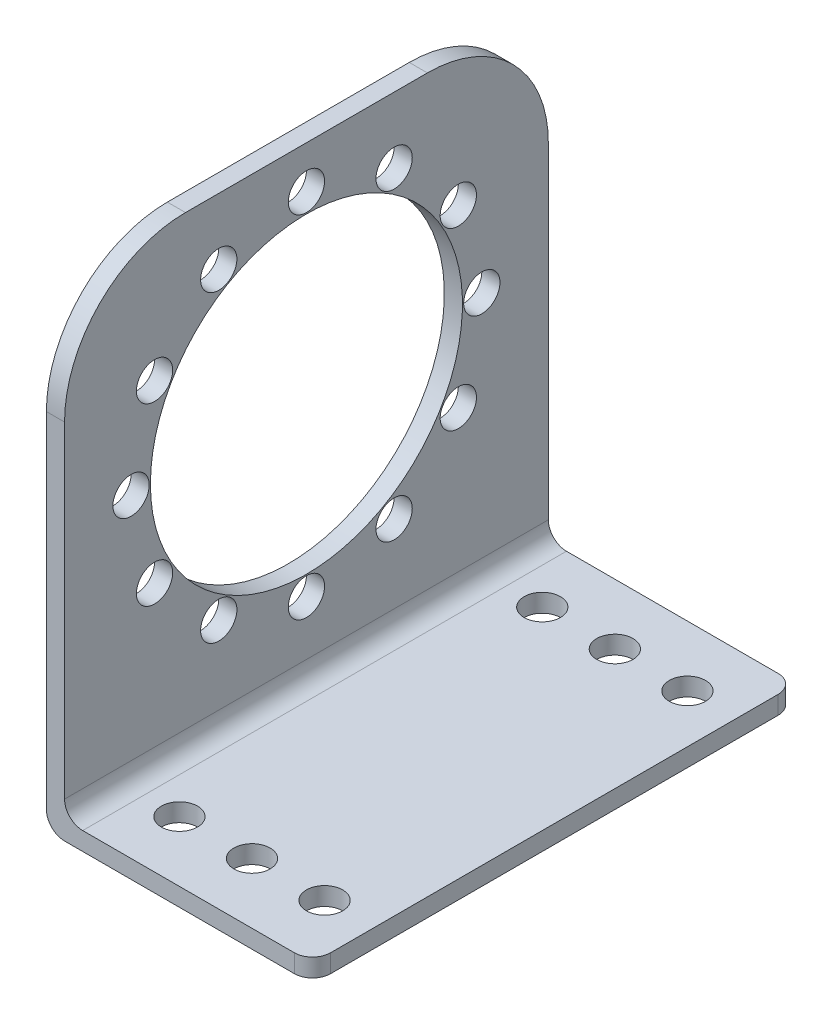
ISO-10303-21;
HEADER;
FILE_DESCRIPTION(('STEP AP214'),'2;1');
FILE_NAME('part.step','',(''),(''),'','','');
FILE_SCHEMA(('AUTOMOTIVE_DESIGN { 1 0 10303 214 1 1 1 1 }'));
ENDSEC;
DATA;
#1=APPLICATION_CONTEXT('core data for automotive mechanical design processes');
#2=APPLICATION_PROTOCOL_DEFINITION('international standard','automotive_design',2000,#1);
#3=PRODUCT_CONTEXT('',#1,'mechanical');
#4=PRODUCT('Part','Part','',(#3));
#5=PRODUCT_RELATED_PRODUCT_CATEGORY('part','',(#4));
#6=PRODUCT_DEFINITION_FORMATION('','',#4);
#7=PRODUCT_DEFINITION_CONTEXT('part definition',#1,'design');
#8=PRODUCT_DEFINITION('design','',#6,#7);
#9=PRODUCT_DEFINITION_SHAPE('','',#8);
#10=(LENGTH_UNIT() NAMED_UNIT(*) SI_UNIT(.MILLI.,.METRE.));
#11=(NAMED_UNIT(*) PLANE_ANGLE_UNIT() SI_UNIT($,.RADIAN.));
#12=(NAMED_UNIT(*) SI_UNIT($,.STERADIAN.) SOLID_ANGLE_UNIT());
#13=UNCERTAINTY_MEASURE_WITH_UNIT(LENGTH_MEASURE(1.E-05),#10,'distance_accuracy_value','');
#14=(GEOMETRIC_REPRESENTATION_CONTEXT(3) GLOBAL_UNCERTAINTY_ASSIGNED_CONTEXT((#13)) GLOBAL_UNIT_ASSIGNED_CONTEXT((#10,
#11,#12)) REPRESENTATION_CONTEXT('',''));
#15=CARTESIAN_POINT('',(0.,0.,0.));
#16=DIRECTION('',(0.,0.,1.));
#17=DIRECTION('',(1.,0.,0.));
#18=AXIS2_PLACEMENT_3D('',#15,#16,#17);
#19=CARTESIAN_POINT('',(1.5,40.,0.));
#20=DIRECTION('',(-1.,0.,0.));
#21=DIRECTION('',(0.,0.,1.));
#22=AXIS2_PLACEMENT_3D('',#19,#20,#21);
#23=PLANE('',#22);
#24=CARTESIAN_POINT('',(1.5,22.,20.));
#25=DIRECTION('',(-1.,0.,0.));
#26=DIRECTION('',(0.,0.,1.));
#27=AXIS2_PLACEMENT_3D('',#24,#25,#26);
#28=CIRCLE('',#27,12.9);
#29=CARTESIAN_POINT('',(1.5,22.,32.9));
#30=VERTEX_POINT('',#29);
#31=EDGE_CURVE('E478',#30,#30,#28,.T.);
#32=ORIENTED_EDGE('',*,*,#31,.T.);
#33=EDGE_LOOP('',(#32));
#34=FACE_BOUND('',#33,.T.);
#35=CARTESIAN_POINT('',(1.5,34.5573683548741,27.2499999999998));
#36=DIRECTION('',(1.,0.,0.));
#37=DIRECTION('',(0.,0.,-1.));
#38=AXIS2_PLACEMENT_3D('',#35,#36,#37);
#39=CIRCLE('',#38,1.5);
#40=CARTESIAN_POINT('',(1.5,34.5573683548741,25.7499999999998));
#41=VERTEX_POINT('',#40);
#42=EDGE_CURVE('E492',#41,#41,#39,.T.);
#43=ORIENTED_EDGE('',*,*,#42,.F.);
#44=EDGE_LOOP('',(#43));
#45=FACE_BOUND('',#44,.T.);
#46=CARTESIAN_POINT('',(1.5,36.5,20.));
#47=DIRECTION('',(1.,0.,0.));
#48=DIRECTION('',(0.,0.,-1.));
#49=AXIS2_PLACEMENT_3D('',#46,#47,#48);
#50=CIRCLE('',#49,1.5);
#51=CARTESIAN_POINT('',(1.5,36.5,18.5));
#52=VERTEX_POINT('',#51);
#53=EDGE_CURVE('E495',#52,#52,#50,.T.);
#54=ORIENTED_EDGE('',*,*,#53,.F.);
#55=EDGE_LOOP('',(#54));
#56=FACE_BOUND('',#55,.T.);
#57=CARTESIAN_POINT('',(1.5,34.5573683548747,12.7499999999999));
#58=DIRECTION('',(1.,0.,0.));
#59=DIRECTION('',(0.,0.,-1.));
#60=AXIS2_PLACEMENT_3D('',#57,#58,#59);
#61=CIRCLE('',#60,1.5);
#62=CARTESIAN_POINT('',(1.5,34.5573683548747,11.2499999999999));
#63=VERTEX_POINT('',#62);
#64=EDGE_CURVE('E498',#63,#63,#61,.T.);
#65=ORIENTED_EDGE('',*,*,#64,.F.);
#66=EDGE_LOOP('',(#65));
#67=FACE_BOUND('',#66,.T.);
#68=CARTESIAN_POINT('',(1.5,29.2500000000005,7.44263164512531));
#69=DIRECTION('',(1.,0.,0.));
#70=DIRECTION('',(0.,0.,-1.));
#71=AXIS2_PLACEMENT_3D('',#68,#69,#70);
#72=CIRCLE('',#71,1.5);
#73=CARTESIAN_POINT('',(1.5,29.2500000000005,5.94263164512531));
#74=VERTEX_POINT('',#73);
#75=EDGE_CURVE('E501',#74,#74,#72,.T.);
#76=ORIENTED_EDGE('',*,*,#75,.F.);
#77=EDGE_LOOP('',(#76));
#78=FACE_BOUND('',#77,.T.);
#79=CARTESIAN_POINT('',(1.5,22.0000000000006,5.49999999999939));
#80=DIRECTION('',(1.,0.,0.));
#81=DIRECTION('',(0.,0.,-1.));
#82=AXIS2_PLACEMENT_3D('',#79,#80,#81);
#83=CIRCLE('',#82,1.5);
#84=CARTESIAN_POINT('',(1.5,22.0000000000006,3.99999999999939));
#85=VERTEX_POINT('',#84);
#86=EDGE_CURVE('E504',#85,#85,#83,.T.);
#87=ORIENTED_EDGE('',*,*,#86,.F.);
#88=EDGE_LOOP('',(#87));
#89=FACE_BOUND('',#88,.T.);
#90=CARTESIAN_POINT('',(1.5,14.7500000000005,7.44263164512475));
#91=DIRECTION('',(1.,0.,0.));
#92=DIRECTION('',(0.,0.,-1.));
#93=AXIS2_PLACEMENT_3D('',#90,#91,#92);
#94=CIRCLE('',#93,1.5);
#95=CARTESIAN_POINT('',(1.5,14.7500000000005,5.94263164512475));
#96=VERTEX_POINT('',#95);
#97=EDGE_CURVE('E507',#96,#96,#94,.T.);
#98=ORIENTED_EDGE('',*,*,#97,.F.);
#99=EDGE_LOOP('',(#98));
#100=FACE_BOUND('',#99,.T.);
#101=CARTESIAN_POINT('',(1.5,9.44263164512591,12.7499999999989));
#102=DIRECTION('',(1.,0.,0.));
#103=DIRECTION('',(0.,0.,-1.));
#104=AXIS2_PLACEMENT_3D('',#101,#102,#103);
#105=CIRCLE('',#104,1.5);
#106=CARTESIAN_POINT('',(1.5,9.44263164512591,11.2499999999989));
#107=VERTEX_POINT('',#106);
#108=EDGE_CURVE('E510',#107,#107,#105,.T.);
#109=ORIENTED_EDGE('',*,*,#108,.F.);
#110=EDGE_LOOP('',(#109));
#111=FACE_BOUND('',#110,.T.);
#112=CARTESIAN_POINT('',(1.5,7.5,19.9999999999989));
#113=DIRECTION('',(1.,0.,0.));
#114=DIRECTION('',(0.,0.,-1.));
#115=AXIS2_PLACEMENT_3D('',#112,#113,#114);
#116=CIRCLE('',#115,1.5);
#117=CARTESIAN_POINT('',(1.5,7.5,18.4999999999989));
#118=VERTEX_POINT('',#117);
#119=EDGE_CURVE('E489',#118,#118,#116,.T.);
#120=ORIENTED_EDGE('',*,*,#119,.F.);
#121=EDGE_LOOP('',(#120));
#122=FACE_BOUND('',#121,.T.);
#123=CARTESIAN_POINT('',(1.5,9.4426316451254,27.249999999999));
#124=DIRECTION('',(1.,0.,0.));
#125=DIRECTION('',(0.,0.,-1.));
#126=AXIS2_PLACEMENT_3D('',#123,#124,#125);
#127=CIRCLE('',#126,1.5);
#128=CARTESIAN_POINT('',(1.5,9.4426316451254,25.749999999999));
#129=VERTEX_POINT('',#128);
#130=EDGE_CURVE('E486',#129,#129,#127,.T.);
#131=ORIENTED_EDGE('',*,*,#130,.F.);
#132=EDGE_LOOP('',(#131));
#133=FACE_BOUND('',#132,.T.);
#134=CARTESIAN_POINT('',(1.5,14.7499999999996,32.5573683548735));
#135=DIRECTION('',(1.,0.,0.));
#136=DIRECTION('',(0.,0.,-1.));
#137=AXIS2_PLACEMENT_3D('',#134,#135,#136);
#138=CIRCLE('',#137,1.5);
#139=CARTESIAN_POINT('',(1.5,14.7499999999996,31.0573683548735));
#140=VERTEX_POINT('',#139);
#141=EDGE_CURVE('E482',#140,#140,#138,.T.);
#142=ORIENTED_EDGE('',*,*,#141,.F.);
#143=EDGE_LOOP('',(#142));
#144=FACE_BOUND('',#143,.T.);
#145=CARTESIAN_POINT('',(1.5,21.9999999999995,34.4999999999994));
#146=DIRECTION('',(1.,0.,0.));
#147=DIRECTION('',(0.,0.,-1.));
#148=AXIS2_PLACEMENT_3D('',#145,#146,#147);
#149=CIRCLE('',#148,1.5);
#150=CARTESIAN_POINT('',(1.5,21.9999999999995,32.9999999999994));
#151=VERTEX_POINT('',#150);
#152=EDGE_CURVE('E479',#151,#151,#149,.T.);
#153=ORIENTED_EDGE('',*,*,#152,.F.);
#154=EDGE_LOOP('',(#153));
#155=FACE_BOUND('',#154,.T.);
#156=CARTESIAN_POINT('',(1.5,29.2499999999996,32.557368354874));
#157=DIRECTION('',(1.,0.,0.));
#158=DIRECTION('',(0.,0.,-1.));
#159=AXIS2_PLACEMENT_3D('',#156,#157,#158);
#160=CIRCLE('',#159,1.5);
#161=CARTESIAN_POINT('',(1.5,29.2499999999996,31.057368354874));
#162=VERTEX_POINT('',#161);
#163=EDGE_CURVE('E207',#162,#162,#160,.T.);
#164=ORIENTED_EDGE('',*,*,#163,.F.);
#165=EDGE_LOOP('',(#164));
#166=FACE_BOUND('',#165,.T.);
#167=DIRECTION('',(0.,-1.,0.));
#168=VECTOR('',#167,1.);
#169=CARTESIAN_POINT('',(1.5,40.,0.));
#170=LINE('',#169,#168);
#171=CARTESIAN_POINT('',(1.5,30.,0.));
#172=VERTEX_POINT('',#171);
#173=CARTESIAN_POINT('',(1.5,3.,0.));
#174=VERTEX_POINT('',#173);
#175=EDGE_CURVE('E300',#172,#174,#170,.T.);
#176=ORIENTED_EDGE('',*,*,#175,.F.);
#177=CARTESIAN_POINT('',(1.5,30.,10.));
#178=DIRECTION('',(-1.,0.,0.));
#179=DIRECTION('',(0.,0.,1.));
#180=AXIS2_PLACEMENT_3D('',#177,#178,#179);
#181=CIRCLE('',#180,10.);
#182=CARTESIAN_POINT('',(1.5,40.,10.));
#183=VERTEX_POINT('',#182);
#184=EDGE_CURVE('E186',#172,#183,#181,.F.);
#185=ORIENTED_EDGE('',*,*,#184,.T.);
#186=DIRECTION('',(0.,0.,-1.));
#187=VECTOR('',#186,1.);
#188=CARTESIAN_POINT('',(1.5,40.,0.));
#189=LINE('',#188,#187);
#190=CARTESIAN_POINT('',(1.5,40.,30.));
#191=VERTEX_POINT('',#190);
#192=EDGE_CURVE('E293',#191,#183,#189,.T.);
#193=ORIENTED_EDGE('',*,*,#192,.F.);
#194=CARTESIAN_POINT('',(1.5,30.,30.));
#195=DIRECTION('',(-1.,0.,0.));
#196=DIRECTION('',(0.,0.,1.));
#197=AXIS2_PLACEMENT_3D('',#194,#195,#196);
#198=CIRCLE('',#197,10.);
#199=CARTESIAN_POINT('',(1.5,30.,40.));
#200=VERTEX_POINT('',#199);
#201=EDGE_CURVE('E174',#191,#200,#198,.F.);
#202=ORIENTED_EDGE('',*,*,#201,.T.);
#203=DIRECTION('',(0.,-1.,0.));
#204=VECTOR('',#203,1.);
#205=CARTESIAN_POINT('',(1.5,40.,40.));
#206=LINE('',#205,#204);
#207=CARTESIAN_POINT('',(1.5,3.,40.));
#208=VERTEX_POINT('',#207);
#209=EDGE_CURVE('E138',#200,#208,#206,.T.);
#210=ORIENTED_EDGE('',*,*,#209,.T.);
#211=DIRECTION('',(0.,0.,1.));
#212=VECTOR('',#211,1.);
#213=CARTESIAN_POINT('',(1.5,3.,0.));
#214=LINE('',#213,#212);
#215=EDGE_CURVE('E162',#208,#174,#214,.F.);
#216=ORIENTED_EDGE('',*,*,#215,.T.);
#217=EDGE_LOOP('',(#176,#185,#193,#202,#210,#216));
#218=FACE_BOUND('',#217,.T.);
#219=ADVANCED_FACE('F36',(#34,#45,#56,#67,#78,#89,#100,#111,#122,#133,#144,#155,#166,#218),#23,.F.);
#220=CARTESIAN_POINT('',(0.,40.,40.));
#221=DIRECTION('',(1.,0.,0.));
#222=DIRECTION('',(0.,0.,-1.));
#223=AXIS2_PLACEMENT_3D('',#220,#221,#222);
#224=PLANE('',#223);
#225=CARTESIAN_POINT('',(0.,22.,20.));
#226=DIRECTION('',(-1.,0.,0.));
#227=DIRECTION('',(0.,0.,1.));
#228=AXIS2_PLACEMENT_3D('',#225,#226,#227);
#229=CIRCLE('',#228,12.9);
#230=CARTESIAN_POINT('',(0.,22.,32.9));
#231=VERTEX_POINT('',#230);
#232=EDGE_CURVE('E476',#231,#231,#229,.T.);
#233=ORIENTED_EDGE('',*,*,#232,.F.);
#234=EDGE_LOOP('',(#233));
#235=FACE_BOUND('',#234,.T.);
#236=CARTESIAN_POINT('',(0.,34.5573683548741,27.2499999999998));
#237=DIRECTION('',(1.,0.,0.));
#238=DIRECTION('',(0.,0.,-1.));
#239=AXIS2_PLACEMENT_3D('',#236,#237,#238);
#240=CIRCLE('',#239,1.5);
#241=CARTESIAN_POINT('',(0.,34.5573683548741,25.7499999999998));
#242=VERTEX_POINT('',#241);
#243=EDGE_CURVE('E40',#242,#242,#240,.T.);
#244=ORIENTED_EDGE('',*,*,#243,.T.);
#245=EDGE_LOOP('',(#244));
#246=FACE_BOUND('',#245,.T.);
#247=CARTESIAN_POINT('',(0.,36.5,20.));
#248=DIRECTION('',(1.,0.,0.));
#249=DIRECTION('',(0.,0.,-1.));
#250=AXIS2_PLACEMENT_3D('',#247,#248,#249);
#251=CIRCLE('',#250,1.5);
#252=CARTESIAN_POINT('',(0.,36.5,18.5));
#253=VERTEX_POINT('',#252);
#254=EDGE_CURVE('E233',#253,#253,#251,.T.);
#255=ORIENTED_EDGE('',*,*,#254,.T.);
#256=EDGE_LOOP('',(#255));
#257=FACE_BOUND('',#256,.T.);
#258=CARTESIAN_POINT('',(0.,34.5573683548747,12.7499999999999));
#259=DIRECTION('',(1.,0.,0.));
#260=DIRECTION('',(0.,0.,-1.));
#261=AXIS2_PLACEMENT_3D('',#258,#259,#260);
#262=CIRCLE('',#261,1.5);
#263=CARTESIAN_POINT('',(0.,34.5573683548747,11.2499999999999));
#264=VERTEX_POINT('',#263);
#265=EDGE_CURVE('E231',#264,#264,#262,.T.);
#266=ORIENTED_EDGE('',*,*,#265,.T.);
#267=EDGE_LOOP('',(#266));
#268=FACE_BOUND('',#267,.T.);
#269=CARTESIAN_POINT('',(0.,29.2500000000005,7.44263164512531));
#270=DIRECTION('',(1.,0.,0.));
#271=DIRECTION('',(0.,0.,-1.));
#272=AXIS2_PLACEMENT_3D('',#269,#270,#271);
#273=CIRCLE('',#272,1.5);
#274=CARTESIAN_POINT('',(0.,29.2500000000005,5.94263164512531));
#275=VERTEX_POINT('',#274);
#276=EDGE_CURVE('E228',#275,#275,#273,.T.);
#277=ORIENTED_EDGE('',*,*,#276,.T.);
#278=EDGE_LOOP('',(#277));
#279=FACE_BOUND('',#278,.T.);
#280=CARTESIAN_POINT('',(0.,22.0000000000006,5.49999999999939));
#281=DIRECTION('',(1.,0.,0.));
#282=DIRECTION('',(0.,0.,-1.));
#283=AXIS2_PLACEMENT_3D('',#280,#281,#282);
#284=CIRCLE('',#283,1.5);
#285=CARTESIAN_POINT('',(0.,22.0000000000006,3.99999999999939));
#286=VERTEX_POINT('',#285);
#287=EDGE_CURVE('E225',#286,#286,#284,.T.);
#288=ORIENTED_EDGE('',*,*,#287,.T.);
#289=EDGE_LOOP('',(#288));
#290=FACE_BOUND('',#289,.T.);
#291=CARTESIAN_POINT('',(0.,14.7500000000005,7.44263164512475));
#292=DIRECTION('',(1.,0.,0.));
#293=DIRECTION('',(0.,0.,-1.));
#294=AXIS2_PLACEMENT_3D('',#291,#292,#293);
#295=CIRCLE('',#294,1.5);
#296=CARTESIAN_POINT('',(0.,14.7500000000005,5.94263164512475));
#297=VERTEX_POINT('',#296);
#298=EDGE_CURVE('E222',#297,#297,#295,.T.);
#299=ORIENTED_EDGE('',*,*,#298,.T.);
#300=EDGE_LOOP('',(#299));
#301=FACE_BOUND('',#300,.T.);
#302=CARTESIAN_POINT('',(0.,9.44263164512591,12.7499999999989));
#303=DIRECTION('',(1.,0.,0.));
#304=DIRECTION('',(0.,0.,-1.));
#305=AXIS2_PLACEMENT_3D('',#302,#303,#304);
#306=CIRCLE('',#305,1.5);
#307=CARTESIAN_POINT('',(0.,9.44263164512591,11.2499999999989));
#308=VERTEX_POINT('',#307);
#309=EDGE_CURVE('E219',#308,#308,#306,.T.);
#310=ORIENTED_EDGE('',*,*,#309,.T.);
#311=EDGE_LOOP('',(#310));
#312=FACE_BOUND('',#311,.T.);
#313=CARTESIAN_POINT('',(0.,7.5,19.9999999999989));
#314=DIRECTION('',(1.,0.,0.));
#315=DIRECTION('',(0.,0.,-1.));
#316=AXIS2_PLACEMENT_3D('',#313,#314,#315);
#317=CIRCLE('',#316,1.5);
#318=CARTESIAN_POINT('',(0.,7.5,18.4999999999989));
#319=VERTEX_POINT('',#318);
#320=EDGE_CURVE('E216',#319,#319,#317,.T.);
#321=ORIENTED_EDGE('',*,*,#320,.T.);
#322=EDGE_LOOP('',(#321));
#323=FACE_BOUND('',#322,.T.);
#324=CARTESIAN_POINT('',(0.,9.4426316451254,27.249999999999));
#325=DIRECTION('',(1.,0.,0.));
#326=DIRECTION('',(0.,0.,-1.));
#327=AXIS2_PLACEMENT_3D('',#324,#325,#326);
#328=CIRCLE('',#327,1.5);
#329=CARTESIAN_POINT('',(0.,9.4426316451254,25.749999999999));
#330=VERTEX_POINT('',#329);
#331=EDGE_CURVE('E213',#330,#330,#328,.T.);
#332=ORIENTED_EDGE('',*,*,#331,.T.);
#333=EDGE_LOOP('',(#332));
#334=FACE_BOUND('',#333,.T.);
#335=CARTESIAN_POINT('',(0.,14.7499999999996,32.5573683548735));
#336=DIRECTION('',(1.,0.,0.));
#337=DIRECTION('',(0.,0.,-1.));
#338=AXIS2_PLACEMENT_3D('',#335,#336,#337);
#339=CIRCLE('',#338,1.5);
#340=CARTESIAN_POINT('',(0.,14.7499999999996,31.0573683548735));
#341=VERTEX_POINT('',#340);
#342=EDGE_CURVE('E210',#341,#341,#339,.T.);
#343=ORIENTED_EDGE('',*,*,#342,.T.);
#344=EDGE_LOOP('',(#343));
#345=FACE_BOUND('',#344,.T.);
#346=CARTESIAN_POINT('',(0.,21.9999999999995,34.4999999999994));
#347=DIRECTION('',(1.,0.,0.));
#348=DIRECTION('',(0.,0.,-1.));
#349=AXIS2_PLACEMENT_3D('',#346,#347,#348);
#350=CIRCLE('',#349,1.5);
#351=CARTESIAN_POINT('',(0.,21.9999999999995,32.9999999999994));
#352=VERTEX_POINT('',#351);
#353=EDGE_CURVE('E206',#352,#352,#350,.T.);
#354=ORIENTED_EDGE('',*,*,#353,.T.);
#355=EDGE_LOOP('',(#354));
#356=FACE_BOUND('',#355,.T.);
#357=CARTESIAN_POINT('',(0.,29.2499999999996,32.557368354874));
#358=DIRECTION('',(1.,0.,0.));
#359=DIRECTION('',(0.,0.,-1.));
#360=AXIS2_PLACEMENT_3D('',#357,#358,#359);
#361=CIRCLE('',#360,1.5);
#362=CARTESIAN_POINT('',(0.,29.2499999999996,31.057368354874));
#363=VERTEX_POINT('',#362);
#364=EDGE_CURVE('E203',#363,#363,#361,.T.);
#365=ORIENTED_EDGE('',*,*,#364,.T.);
#366=EDGE_LOOP('',(#365));
#367=FACE_BOUND('',#366,.T.);
#368=DIRECTION('',(0.,0.,1.));
#369=VECTOR('',#368,1.);
#370=CARTESIAN_POINT('',(0.,40.,40.));
#371=LINE('',#370,#369);
#372=CARTESIAN_POINT('',(0.,40.,10.));
#373=VERTEX_POINT('',#372);
#374=CARTESIAN_POINT('',(0.,40.,30.));
#375=VERTEX_POINT('',#374);
#376=EDGE_CURVE('E291',#373,#375,#371,.T.);
#377=ORIENTED_EDGE('',*,*,#376,.F.);
#378=CARTESIAN_POINT('',(0.,30.,10.));
#379=DIRECTION('',(1.,0.,0.));
#380=DIRECTION('',(0.,0.,-1.));
#381=AXIS2_PLACEMENT_3D('',#378,#379,#380);
#382=CIRCLE('',#381,10.);
#383=CARTESIAN_POINT('',(0.,30.,0.));
#384=VERTEX_POINT('',#383);
#385=EDGE_CURVE('E182',#373,#384,#382,.F.);
#386=ORIENTED_EDGE('',*,*,#385,.T.);
#387=DIRECTION('',(0.,-1.,0.));
#388=VECTOR('',#387,1.);
#389=CARTESIAN_POINT('',(0.,40.,0.));
#390=LINE('',#389,#388);
#391=CARTESIAN_POINT('',(0.,1.5,0.));
#392=VERTEX_POINT('',#391);
#393=EDGE_CURVE('E151',#384,#392,#390,.T.);
#394=ORIENTED_EDGE('',*,*,#393,.T.);
#395=DIRECTION('',(0.,0.,1.));
#396=VECTOR('',#395,1.);
#397=CARTESIAN_POINT('',(0.,1.5,40.));
#398=LINE('',#397,#396);
#399=CARTESIAN_POINT('',(0.,1.5,40.));
#400=VERTEX_POINT('',#399);
#401=EDGE_CURVE('E137',#392,#400,#398,.T.);
#402=ORIENTED_EDGE('',*,*,#401,.T.);
#403=DIRECTION('',(0.,-1.,0.));
#404=VECTOR('',#403,1.);
#405=CARTESIAN_POINT('',(0.,40.,40.));
#406=LINE('',#405,#404);
#407=CARTESIAN_POINT('',(0.,30.,40.));
#408=VERTEX_POINT('',#407);
#409=EDGE_CURVE('E124',#408,#400,#406,.T.);
#410=ORIENTED_EDGE('',*,*,#409,.F.);
#411=CARTESIAN_POINT('',(0.,30.,30.));
#412=DIRECTION('',(1.,0.,0.));
#413=DIRECTION('',(0.,0.,-1.));
#414=AXIS2_PLACEMENT_3D('',#411,#412,#413);
#415=CIRCLE('',#414,10.);
#416=EDGE_CURVE('E177',#408,#375,#415,.F.);
#417=ORIENTED_EDGE('',*,*,#416,.T.);
#418=EDGE_LOOP('',(#377,#386,#394,#402,#410,#417));
#419=FACE_BOUND('',#418,.T.);
#420=ADVANCED_FACE('F149',(#235,#246,#257,#268,#279,#290,#301,#312,#323,#334,#345,#356,#367,
#419),#224,.F.);
#421=CARTESIAN_POINT('',(1.5,40.,40.));
#422=DIRECTION('',(0.,0.,-1.));
#423=DIRECTION('',(-1.,0.,0.));
#424=AXIS2_PLACEMENT_3D('',#421,#422,#423);
#425=PLANE('',#424);
#426=DIRECTION('',(1.,0.,0.));
#427=VECTOR('',#426,1.);
#428=CARTESIAN_POINT('',(1.5,0.,40.));
#429=LINE('',#428,#427);
#430=CARTESIAN_POINT('',(1.5,0.,40.));
#431=VERTEX_POINT('',#430);
#432=CARTESIAN_POINT('',(20.5,0.,40.));
#433=VERTEX_POINT('',#432);
#434=EDGE_CURVE('E290',#431,#433,#429,.T.);
#435=ORIENTED_EDGE('',*,*,#434,.T.);
#436=DIRECTION('',(0.,-1.,0.));
#437=VECTOR('',#436,1.);
#438=CARTESIAN_POINT('',(20.5,40.,40.));
#439=LINE('',#438,#437);
#440=CARTESIAN_POINT('',(20.5,1.5,40.));
#441=VERTEX_POINT('',#440);
#442=EDGE_CURVE('E193',#433,#441,#439,.F.);
#443=ORIENTED_EDGE('',*,*,#442,.T.);
#444=DIRECTION('',(-1.,0.,0.));
#445=VECTOR('',#444,1.);
#446=CARTESIAN_POINT('',(22.,1.5,40.));
#447=LINE('',#446,#445);
#448=CARTESIAN_POINT('',(3.,1.5,40.));
#449=VERTEX_POINT('',#448);
#450=EDGE_CURVE('E286',#441,#449,#447,.T.);
#451=ORIENTED_EDGE('',*,*,#450,.T.);
#452=CARTESIAN_POINT('',(3.,3.,40.));
#453=DIRECTION('',(0.,0.,-1.));
#454=DIRECTION('',(-1.,0.,0.));
#455=AXIS2_PLACEMENT_3D('',#452,#453,#454);
#456=CIRCLE('',#455,1.5);
#457=EDGE_CURVE('E165',#449,#208,#456,.T.);
#458=ORIENTED_EDGE('',*,*,#457,.T.);
#459=ORIENTED_EDGE('',*,*,#209,.F.);
#460=DIRECTION('',(1.,0.,0.));
#461=VECTOR('',#460,1.);
#462=CARTESIAN_POINT('',(1.5,30.,40.));
#463=LINE('',#462,#461);
#464=EDGE_CURVE('E132',#200,#408,#463,.F.);
#465=ORIENTED_EDGE('',*,*,#464,.T.);
#466=ORIENTED_EDGE('',*,*,#409,.T.);
#467=CARTESIAN_POINT('',(1.5,1.5,40.));
#468=DIRECTION('',(0.,0.,-1.));
#469=DIRECTION('',(-1.,0.,0.));
#470=AXIS2_PLACEMENT_3D('',#467,#468,#469);
#471=CIRCLE('',#470,1.5);
#472=EDGE_CURVE('E128',#400,#431,#471,.F.);
#473=ORIENTED_EDGE('',*,*,#472,.T.);
#474=EDGE_LOOP('',(#435,#443,#451,#458,#459,#465,#466,#473));
#475=FACE_BOUND('',#474,.T.);
#476=ADVANCED_FACE('F127',(#475),#425,.F.);
#477=CARTESIAN_POINT('',(0.,40.,0.));
#478=DIRECTION('',(0.,0.,1.));
#479=DIRECTION('',(1.,0.,0.));
#480=AXIS2_PLACEMENT_3D('',#477,#478,#479);
#481=PLANE('',#480);
#482=DIRECTION('',(-1.,0.,0.));
#483=VECTOR('',#482,1.);
#484=CARTESIAN_POINT('',(22.,1.5,0.));
#485=LINE('',#484,#483);
#486=CARTESIAN_POINT('',(20.5,1.5,0.));
#487=VERTEX_POINT('',#486);
#488=CARTESIAN_POINT('',(3.,1.5,0.));
#489=VERTEX_POINT('',#488);
#490=EDGE_CURVE('E288',#487,#489,#485,.T.);
#491=ORIENTED_EDGE('',*,*,#490,.F.);
#492=DIRECTION('',(0.,1.,0.));
#493=VECTOR('',#492,1.);
#494=CARTESIAN_POINT('',(20.5,40.,0.));
#495=LINE('',#494,#493);
#496=CARTESIAN_POINT('',(20.5,0.,0.));
#497=VERTEX_POINT('',#496);
#498=EDGE_CURVE('E45',#487,#497,#495,.F.);
#499=ORIENTED_EDGE('',*,*,#498,.T.);
#500=DIRECTION('',(-1.,0.,0.));
#501=VECTOR('',#500,1.);
#502=CARTESIAN_POINT('',(0.,0.,0.));
#503=LINE('',#502,#501);
#504=CARTESIAN_POINT('',(1.5,0.,0.));
#505=VERTEX_POINT('',#504);
#506=EDGE_CURVE('E294',#497,#505,#503,.T.);
#507=ORIENTED_EDGE('',*,*,#506,.T.);
#508=CARTESIAN_POINT('',(1.5,1.5,0.));
#509=DIRECTION('',(0.,0.,1.));
#510=DIRECTION('',(1.,0.,0.));
#511=AXIS2_PLACEMENT_3D('',#508,#509,#510);
#512=CIRCLE('',#511,1.5);
#513=EDGE_CURVE('E157',#505,#392,#512,.F.);
#514=ORIENTED_EDGE('',*,*,#513,.T.);
#515=ORIENTED_EDGE('',*,*,#393,.F.);
#516=DIRECTION('',(-1.,0.,0.));
#517=VECTOR('',#516,1.);
#518=CARTESIAN_POINT('',(0.,30.,0.));
#519=LINE('',#518,#517);
#520=EDGE_CURVE('E184',#384,#172,#519,.F.);
#521=ORIENTED_EDGE('',*,*,#520,.T.);
#522=ORIENTED_EDGE('',*,*,#175,.T.);
#523=CARTESIAN_POINT('',(3.,3.,0.));
#524=DIRECTION('',(0.,0.,1.));
#525=DIRECTION('',(1.,0.,0.));
#526=AXIS2_PLACEMENT_3D('',#523,#524,#525);
#527=CIRCLE('',#526,1.5);
#528=EDGE_CURVE('E168',#174,#489,#527,.T.);
#529=ORIENTED_EDGE('',*,*,#528,.T.);
#530=EDGE_LOOP('',(#491,#499,#507,#514,#515,#521,#522,#529));
#531=FACE_BOUND('',#530,.T.);
#532=ADVANCED_FACE('F311',(#531),#481,.F.);
#533=CARTESIAN_POINT('',(0.,40.,0.));
#534=DIRECTION('',(0.,-1.,0.));
#535=DIRECTION('',(0.,0.,-1.));
#536=AXIS2_PLACEMENT_3D('',#533,#534,#535);
#537=PLANE('',#536);
#538=ORIENTED_EDGE('',*,*,#192,.T.);
#539=DIRECTION('',(-1.,0.,0.));
#540=VECTOR('',#539,1.);
#541=CARTESIAN_POINT('',(0.,40.,10.));
#542=LINE('',#541,#540);
#543=EDGE_CURVE('E179',#183,#373,#542,.T.);
#544=ORIENTED_EDGE('',*,*,#543,.T.);
#545=ORIENTED_EDGE('',*,*,#376,.T.);
#546=DIRECTION('',(1.,0.,0.));
#547=VECTOR('',#546,1.);
#548=CARTESIAN_POINT('',(0.,40.,30.));
#549=LINE('',#548,#547);
#550=EDGE_CURVE('E171',#375,#191,#549,.T.);
#551=ORIENTED_EDGE('',*,*,#550,.T.);
#552=EDGE_LOOP('',(#538,#544,#545,#551));
#553=FACE_BOUND('',#552,.T.);
#554=ADVANCED_FACE('F318',(#553),#537,.F.);
#555=CARTESIAN_POINT('',(0.,0.,0.));
#556=DIRECTION('',(0.,-1.,0.));
#557=DIRECTION('',(0.,0.,-1.));
#558=AXIS2_PLACEMENT_3D('',#555,#556,#557);
#559=PLANE('',#558);
#560=CARTESIAN_POINT('',(18.,0.,5.));
#561=DIRECTION('',(0.,-1.,0.));
#562=DIRECTION('',(0.,0.,-1.));
#563=AXIS2_PLACEMENT_3D('',#560,#561,#562);
#564=CIRCLE('',#563,1.5);
#565=CARTESIAN_POINT('',(18.,0.,3.5));
#566=VERTEX_POINT('',#565);
#567=EDGE_CURVE('E278',#566,#566,#564,.T.);
#568=ORIENTED_EDGE('',*,*,#567,.F.);
#569=EDGE_LOOP('',(#568));
#570=FACE_BOUND('',#569,.T.);
#571=CARTESIAN_POINT('',(6.,0.,5.00000000000001));
#572=DIRECTION('',(0.,-1.,0.));
#573=DIRECTION('',(0.,0.,-1.));
#574=AXIS2_PLACEMENT_3D('',#571,#572,#573);
#575=CIRCLE('',#574,1.5);
#576=CARTESIAN_POINT('',(6.,0.,3.50000000000001));
#577=VERTEX_POINT('',#576);
#578=EDGE_CURVE('E275',#577,#577,#575,.T.);
#579=ORIENTED_EDGE('',*,*,#578,.F.);
#580=EDGE_LOOP('',(#579));
#581=FACE_BOUND('',#580,.T.);
#582=CARTESIAN_POINT('',(18.,0.,35.));
#583=DIRECTION('',(0.,-1.,0.));
#584=DIRECTION('',(0.,0.,-1.));
#585=AXIS2_PLACEMENT_3D('',#582,#583,#584);
#586=CIRCLE('',#585,1.5);
#587=CARTESIAN_POINT('',(18.,0.,33.5));
#588=VERTEX_POINT('',#587);
#589=EDGE_CURVE('E272',#588,#588,#586,.T.);
#590=ORIENTED_EDGE('',*,*,#589,.F.);
#591=EDGE_LOOP('',(#590));
#592=FACE_BOUND('',#591,.T.);
#593=CARTESIAN_POINT('',(12.,0.,35.));
#594=DIRECTION('',(0.,-1.,0.));
#595=DIRECTION('',(0.,0.,-1.));
#596=AXIS2_PLACEMENT_3D('',#593,#594,#595);
#597=CIRCLE('',#596,1.5);
#598=CARTESIAN_POINT('',(12.,0.,33.5));
#599=VERTEX_POINT('',#598);
#600=EDGE_CURVE('E269',#599,#599,#597,.T.);
#601=ORIENTED_EDGE('',*,*,#600,.F.);
#602=EDGE_LOOP('',(#601));
#603=FACE_BOUND('',#602,.T.);
#604=CARTESIAN_POINT('',(6.,0.,35.));
#605=DIRECTION('',(0.,-1.,0.));
#606=DIRECTION('',(0.,0.,-1.));
#607=AXIS2_PLACEMENT_3D('',#604,#605,#606);
#608=CIRCLE('',#607,1.5);
#609=CARTESIAN_POINT('',(6.,0.,33.5));
#610=VERTEX_POINT('',#609);
#611=EDGE_CURVE('E266',#610,#610,#608,.T.);
#612=ORIENTED_EDGE('',*,*,#611,.F.);
#613=EDGE_LOOP('',(#612));
#614=FACE_BOUND('',#613,.T.);
#615=CARTESIAN_POINT('',(12.,0.,5.));
#616=DIRECTION('',(0.,-1.,0.));
#617=DIRECTION('',(0.,0.,-1.));
#618=AXIS2_PLACEMENT_3D('',#615,#616,#617);
#619=CIRCLE('',#618,1.5);
#620=CARTESIAN_POINT('',(12.,0.,3.50000000000001));
#621=VERTEX_POINT('',#620);
#622=EDGE_CURVE('E263',#621,#621,#619,.T.);
#623=ORIENTED_EDGE('',*,*,#622,.F.);
#624=EDGE_LOOP('',(#623));
#625=FACE_BOUND('',#624,.T.);
#626=ORIENTED_EDGE('',*,*,#506,.F.);
#627=CARTESIAN_POINT('',(20.5,0.,1.5));
#628=DIRECTION('',(0.,-1.,0.));
#629=DIRECTION('',(0.,0.,-1.));
#630=AXIS2_PLACEMENT_3D('',#627,#628,#629);
#631=CIRCLE('',#630,1.5);
#632=CARTESIAN_POINT('',(22.,0.,1.5));
#633=VERTEX_POINT('',#632);
#634=EDGE_CURVE('E11',#497,#633,#631,.T.);
#635=ORIENTED_EDGE('',*,*,#634,.T.);
#636=DIRECTION('',(0.,0.,-1.));
#637=VECTOR('',#636,1.);
#638=CARTESIAN_POINT('',(22.,0.,0.));
#639=LINE('',#638,#637);
#640=CARTESIAN_POINT('',(22.,0.,38.5));
#641=VERTEX_POINT('',#640);
#642=EDGE_CURVE('E281',#641,#633,#639,.T.);
#643=ORIENTED_EDGE('',*,*,#642,.F.);
#644=CARTESIAN_POINT('',(20.5,0.,38.5));
#645=DIRECTION('',(0.,-1.,0.));
#646=DIRECTION('',(0.,0.,-1.));
#647=AXIS2_PLACEMENT_3D('',#644,#645,#646);
#648=CIRCLE('',#647,1.5);
#649=EDGE_CURVE('E191',#641,#433,#648,.T.);
#650=ORIENTED_EDGE('',*,*,#649,.T.);
#651=ORIENTED_EDGE('',*,*,#434,.F.);
#652=DIRECTION('',(0.,0.,1.));
#653=VECTOR('',#652,1.);
#654=CARTESIAN_POINT('',(1.5,0.,0.));
#655=LINE('',#654,#653);
#656=EDGE_CURVE('E146',#431,#505,#655,.F.);
#657=ORIENTED_EDGE('',*,*,#656,.T.);
#658=EDGE_LOOP('',(#626,#635,#643,#650,#651,#657));
#659=FACE_BOUND('',#658,.T.);
#660=ADVANCED_FACE('F383',(#570,#581,#592,#603,#614,#625,#659),#559,.T.);
#661=CARTESIAN_POINT('',(22.,1.5,40.));
#662=DIRECTION('',(0.,-1.,0.));
#663=DIRECTION('',(0.,0.,-1.));
#664=AXIS2_PLACEMENT_3D('',#661,#662,#663);
#665=PLANE('',#664);
#666=CARTESIAN_POINT('',(18.,1.5,5.));
#667=DIRECTION('',(0.,1.,0.));
#668=DIRECTION('',(0.,0.,1.));
#669=AXIS2_PLACEMENT_3D('',#666,#667,#668);
#670=CIRCLE('',#669,1.5);
#671=CARTESIAN_POINT('',(18.,1.5,6.50000000000001));
#672=VERTEX_POINT('',#671);
#673=EDGE_CURVE('E252',#672,#672,#670,.T.);
#674=ORIENTED_EDGE('',*,*,#673,.F.);
#675=EDGE_LOOP('',(#674));
#676=FACE_BOUND('',#675,.T.);
#677=CARTESIAN_POINT('',(6.,1.5,5.00000000000001));
#678=DIRECTION('',(0.,1.,0.));
#679=DIRECTION('',(0.,0.,1.));
#680=AXIS2_PLACEMENT_3D('',#677,#678,#679);
#681=CIRCLE('',#680,1.5);
#682=CARTESIAN_POINT('',(6.,1.5,6.50000000000001));
#683=VERTEX_POINT('',#682);
#684=EDGE_CURVE('E256',#683,#683,#681,.T.);
#685=ORIENTED_EDGE('',*,*,#684,.F.);
#686=EDGE_LOOP('',(#685));
#687=FACE_BOUND('',#686,.T.);
#688=CARTESIAN_POINT('',(18.,1.5,35.));
#689=DIRECTION('',(0.,1.,0.));
#690=DIRECTION('',(0.,0.,1.));
#691=AXIS2_PLACEMENT_3D('',#688,#689,#690);
#692=CIRCLE('',#691,1.5);
#693=CARTESIAN_POINT('',(18.,1.5,36.5));
#694=VERTEX_POINT('',#693);
#695=EDGE_CURVE('E247',#694,#694,#692,.T.);
#696=ORIENTED_EDGE('',*,*,#695,.F.);
#697=EDGE_LOOP('',(#696));
#698=FACE_BOUND('',#697,.T.);
#699=CARTESIAN_POINT('',(12.,1.5,35.));
#700=DIRECTION('',(0.,1.,0.));
#701=DIRECTION('',(0.,0.,1.));
#702=AXIS2_PLACEMENT_3D('',#699,#700,#701);
#703=CIRCLE('',#702,1.5);
#704=CARTESIAN_POINT('',(12.,1.5,36.5));
#705=VERTEX_POINT('',#704);
#706=EDGE_CURVE('E242',#705,#705,#703,.T.);
#707=ORIENTED_EDGE('',*,*,#706,.F.);
#708=EDGE_LOOP('',(#707));
#709=FACE_BOUND('',#708,.T.);
#710=CARTESIAN_POINT('',(6.,1.5,35.));
#711=DIRECTION('',(0.,1.,0.));
#712=DIRECTION('',(0.,0.,1.));
#713=AXIS2_PLACEMENT_3D('',#710,#711,#712);
#714=CIRCLE('',#713,1.5);
#715=CARTESIAN_POINT('',(6.,1.5,36.5));
#716=VERTEX_POINT('',#715);
#717=EDGE_CURVE('E238',#716,#716,#714,.T.);
#718=ORIENTED_EDGE('',*,*,#717,.F.);
#719=EDGE_LOOP('',(#718));
#720=FACE_BOUND('',#719,.T.);
#721=CARTESIAN_POINT('',(12.,1.5,5.));
#722=DIRECTION('',(0.,1.,0.));
#723=DIRECTION('',(0.,0.,1.));
#724=AXIS2_PLACEMENT_3D('',#721,#722,#723);
#725=CIRCLE('',#724,1.5);
#726=CARTESIAN_POINT('',(12.,1.5,6.5));
#727=VERTEX_POINT('',#726);
#728=EDGE_CURVE('E255',#727,#727,#725,.T.);
#729=ORIENTED_EDGE('',*,*,#728,.F.);
#730=EDGE_LOOP('',(#729));
#731=FACE_BOUND('',#730,.T.);
#732=DIRECTION('',(0.,0.,1.));
#733=VECTOR('',#732,1.);
#734=CARTESIAN_POINT('',(22.,1.5,40.));
#735=LINE('',#734,#733);
#736=CARTESIAN_POINT('',(22.,1.5,1.5));
#737=VERTEX_POINT('',#736);
#738=CARTESIAN_POINT('',(22.,1.5,38.5));
#739=VERTEX_POINT('',#738);
#740=EDGE_CURVE('E284',#737,#739,#735,.T.);
#741=ORIENTED_EDGE('',*,*,#740,.F.);
#742=CARTESIAN_POINT('',(20.5,1.5,1.5));
#743=DIRECTION('',(0.,-1.,0.));
#744=DIRECTION('',(0.,0.,-1.));
#745=AXIS2_PLACEMENT_3D('',#742,#743,#744);
#746=CIRCLE('',#745,1.5);
#747=EDGE_CURVE('E60',#737,#487,#746,.F.);
#748=ORIENTED_EDGE('',*,*,#747,.T.);
#749=ORIENTED_EDGE('',*,*,#490,.T.);
#750=DIRECTION('',(0.,0.,1.));
#751=VECTOR('',#750,1.);
#752=CARTESIAN_POINT('',(3.,1.5,40.));
#753=LINE('',#752,#751);
#754=EDGE_CURVE('E159',#489,#449,#753,.T.);
#755=ORIENTED_EDGE('',*,*,#754,.T.);
#756=ORIENTED_EDGE('',*,*,#450,.F.);
#757=CARTESIAN_POINT('',(20.5,1.5,38.5));
#758=DIRECTION('',(0.,-1.,0.));
#759=DIRECTION('',(0.,0.,-1.));
#760=AXIS2_PLACEMENT_3D('',#757,#758,#759);
#761=CIRCLE('',#760,1.5);
#762=EDGE_CURVE('E195',#441,#739,#761,.F.);
#763=ORIENTED_EDGE('',*,*,#762,.T.);
#764=EDGE_LOOP('',(#741,#748,#749,#755,#756,#763));
#765=FACE_BOUND('',#764,.T.);
#766=ADVANCED_FACE('F379',(#676,#687,#698,#709,#720,#731,#765),#665,.F.);
#767=CARTESIAN_POINT('',(22.,0.,0.));
#768=DIRECTION('',(-1.,0.,0.));
#769=DIRECTION('',(0.,0.,1.));
#770=AXIS2_PLACEMENT_3D('',#767,#768,#769);
#771=PLANE('',#770);
#772=ORIENTED_EDGE('',*,*,#642,.T.);
#773=DIRECTION('',(0.,1.,0.));
#774=VECTOR('',#773,1.);
#775=CARTESIAN_POINT('',(22.,0.,1.5));
#776=LINE('',#775,#774);
#777=EDGE_CURVE('E198',#633,#737,#776,.T.);
#778=ORIENTED_EDGE('',*,*,#777,.T.);
#779=ORIENTED_EDGE('',*,*,#740,.T.);
#780=DIRECTION('',(0.,-1.,0.));
#781=VECTOR('',#780,1.);
#782=CARTESIAN_POINT('',(22.,0.,38.5));
#783=LINE('',#782,#781);
#784=EDGE_CURVE('E188',#739,#641,#783,.T.);
#785=ORIENTED_EDGE('',*,*,#784,.T.);
#786=EDGE_LOOP('',(#772,#778,#779,#785));
#787=FACE_BOUND('',#786,.T.);
#788=ADVANCED_FACE('F375',(#787),#771,.F.);
#789=CARTESIAN_POINT('',(12.,-19.,5.));
#790=DIRECTION('',(0.,1.,0.));
#791=DIRECTION('',(0.,0.,1.));
#792=AXIS2_PLACEMENT_3D('',#789,#790,#791);
#793=CYLINDRICAL_SURFACE('',#792,1.5);
#794=ORIENTED_EDGE('',*,*,#622,.T.);
#795=EDGE_LOOP('',(#794));
#796=FACE_BOUND('',#795,.T.);
#797=ORIENTED_EDGE('',*,*,#728,.T.);
#798=EDGE_LOOP('',(#797));
#799=FACE_BOUND('',#798,.T.);
#800=ADVANCED_FACE('F372',(#796,#799),#793,.F.);
#801=CARTESIAN_POINT('',(6.,-19.,35.));
#802=DIRECTION('',(0.,1.,0.));
#803=DIRECTION('',(0.,0.,1.));
#804=AXIS2_PLACEMENT_3D('',#801,#802,#803);
#805=CYLINDRICAL_SURFACE('',#804,1.5);
#806=ORIENTED_EDGE('',*,*,#611,.T.);
#807=EDGE_LOOP('',(#806));
#808=FACE_BOUND('',#807,.T.);
#809=ORIENTED_EDGE('',*,*,#717,.T.);
#810=EDGE_LOOP('',(#809));
#811=FACE_BOUND('',#810,.T.);
#812=ADVANCED_FACE('F362',(#808,#811),#805,.F.);
#813=CARTESIAN_POINT('',(12.,-19.,35.));
#814=DIRECTION('',(0.,1.,0.));
#815=DIRECTION('',(0.,0.,1.));
#816=AXIS2_PLACEMENT_3D('',#813,#814,#815);
#817=CYLINDRICAL_SURFACE('',#816,1.5);
#818=ORIENTED_EDGE('',*,*,#600,.T.);
#819=EDGE_LOOP('',(#818));
#820=FACE_BOUND('',#819,.T.);
#821=ORIENTED_EDGE('',*,*,#706,.T.);
#822=EDGE_LOOP('',(#821));
#823=FACE_BOUND('',#822,.T.);
#824=ADVANCED_FACE('F367',(#820,#823),#817,.F.);
#825=CARTESIAN_POINT('',(18.,-19.,35.));
#826=DIRECTION('',(0.,1.,0.));
#827=DIRECTION('',(0.,0.,1.));
#828=AXIS2_PLACEMENT_3D('',#825,#826,#827);
#829=CYLINDRICAL_SURFACE('',#828,1.5);
#830=ORIENTED_EDGE('',*,*,#589,.T.);
#831=EDGE_LOOP('',(#830));
#832=FACE_BOUND('',#831,.T.);
#833=ORIENTED_EDGE('',*,*,#695,.T.);
#834=EDGE_LOOP('',(#833));
#835=FACE_BOUND('',#834,.T.);
#836=ADVANCED_FACE('F357',(#832,#835),#829,.F.);
#837=CARTESIAN_POINT('',(6.,-19.,5.00000000000001));
#838=DIRECTION('',(0.,1.,0.));
#839=DIRECTION('',(0.,0.,1.));
#840=AXIS2_PLACEMENT_3D('',#837,#838,#839);
#841=CYLINDRICAL_SURFACE('',#840,1.5);
#842=ORIENTED_EDGE('',*,*,#578,.T.);
#843=EDGE_LOOP('',(#842));
#844=FACE_BOUND('',#843,.T.);
#845=ORIENTED_EDGE('',*,*,#684,.T.);
#846=EDGE_LOOP('',(#845));
#847=FACE_BOUND('',#846,.T.);
#848=ADVANCED_FACE('F351',(#844,#847),#841,.F.);
#849=CARTESIAN_POINT('',(18.,-19.,5.));
#850=DIRECTION('',(0.,1.,0.));
#851=DIRECTION('',(0.,0.,1.));
#852=AXIS2_PLACEMENT_3D('',#849,#850,#851);
#853=CYLINDRICAL_SURFACE('',#852,1.5);
#854=ORIENTED_EDGE('',*,*,#567,.T.);
#855=EDGE_LOOP('',(#854));
#856=FACE_BOUND('',#855,.T.);
#857=ORIENTED_EDGE('',*,*,#673,.T.);
#858=EDGE_LOOP('',(#857));
#859=FACE_BOUND('',#858,.T.);
#860=ADVANCED_FACE('F347',(#856,#859),#853,.F.);
#861=CARTESIAN_POINT('',(1.5,1.5,40.));
#862=DIRECTION('',(0.,0.,-1.));
#863=DIRECTION('',(-1.,0.,0.));
#864=AXIS2_PLACEMENT_3D('',#861,#862,#863);
#865=CYLINDRICAL_SURFACE('',#864,1.5);
#866=ORIENTED_EDGE('',*,*,#513,.F.);
#867=ORIENTED_EDGE('',*,*,#656,.F.);
#868=ORIENTED_EDGE('',*,*,#472,.F.);
#869=ORIENTED_EDGE('',*,*,#401,.F.);
#870=EDGE_LOOP('',(#866,#867,#868,#869));
#871=FACE_BOUND('',#870,.T.);
#872=ADVANCED_FACE('F144',(#871),#865,.T.);
#873=CARTESIAN_POINT('',(3.,3.,40.));
#874=DIRECTION('',(0.,0.,-1.));
#875=DIRECTION('',(-1.,0.,0.));
#876=AXIS2_PLACEMENT_3D('',#873,#874,#875);
#877=CYLINDRICAL_SURFACE('',#876,1.5);
#878=ORIENTED_EDGE('',*,*,#528,.F.);
#879=ORIENTED_EDGE('',*,*,#215,.F.);
#880=ORIENTED_EDGE('',*,*,#457,.F.);
#881=ORIENTED_EDGE('',*,*,#754,.F.);
#882=EDGE_LOOP('',(#878,#879,#880,#881));
#883=FACE_BOUND('',#882,.T.);
#884=ADVANCED_FACE('F310',(#883),#877,.F.);
#885=CARTESIAN_POINT('',(0.,30.,30.));
#886=DIRECTION('',(1.,0.,0.));
#887=DIRECTION('',(0.,0.,-1.));
#888=AXIS2_PLACEMENT_3D('',#885,#886,#887);
#889=CYLINDRICAL_SURFACE('',#888,10.);
#890=ORIENTED_EDGE('',*,*,#416,.F.);
#891=ORIENTED_EDGE('',*,*,#464,.F.);
#892=ORIENTED_EDGE('',*,*,#201,.F.);
#893=ORIENTED_EDGE('',*,*,#550,.F.);
#894=EDGE_LOOP('',(#890,#891,#892,#893));
#895=FACE_BOUND('',#894,.T.);
#896=ADVANCED_FACE('F321',(#895),#889,.T.);
#897=CARTESIAN_POINT('',(0.,30.,10.));
#898=DIRECTION('',(-1.,0.,0.));
#899=DIRECTION('',(0.,0.,1.));
#900=AXIS2_PLACEMENT_3D('',#897,#898,#899);
#901=CYLINDRICAL_SURFACE('',#900,10.);
#902=ORIENTED_EDGE('',*,*,#184,.F.);
#903=ORIENTED_EDGE('',*,*,#520,.F.);
#904=ORIENTED_EDGE('',*,*,#385,.F.);
#905=ORIENTED_EDGE('',*,*,#543,.F.);
#906=EDGE_LOOP('',(#902,#903,#904,#905));
#907=FACE_BOUND('',#906,.T.);
#908=ADVANCED_FACE('F316',(#907),#901,.T.);
#909=CARTESIAN_POINT('',(20.5,0.,38.5));
#910=DIRECTION('',(0.,-1.,0.));
#911=DIRECTION('',(0.,0.,-1.));
#912=AXIS2_PLACEMENT_3D('',#909,#910,#911);
#913=CYLINDRICAL_SURFACE('',#912,1.5);
#914=ORIENTED_EDGE('',*,*,#762,.F.);
#915=ORIENTED_EDGE('',*,*,#442,.F.);
#916=ORIENTED_EDGE('',*,*,#649,.F.);
#917=ORIENTED_EDGE('',*,*,#784,.F.);
#918=EDGE_LOOP('',(#914,#915,#916,#917));
#919=FACE_BOUND('',#918,.T.);
#920=ADVANCED_FACE('F328',(#919),#913,.T.);
#921=CARTESIAN_POINT('',(20.5,0.,1.5));
#922=DIRECTION('',(0.,1.,0.));
#923=DIRECTION('',(0.,0.,1.));
#924=AXIS2_PLACEMENT_3D('',#921,#922,#923);
#925=CYLINDRICAL_SURFACE('',#924,1.5);
#926=ORIENTED_EDGE('',*,*,#634,.F.);
#927=ORIENTED_EDGE('',*,*,#498,.F.);
#928=ORIENTED_EDGE('',*,*,#747,.F.);
#929=ORIENTED_EDGE('',*,*,#777,.F.);
#930=EDGE_LOOP('',(#926,#927,#928,#929));
#931=FACE_BOUND('',#930,.T.);
#932=ADVANCED_FACE('F38',(#931),#925,.T.);
#933=CARTESIAN_POINT('',(-2.5,29.2499999999996,32.557368354874));
#934=DIRECTION('',(1.,0.,0.));
#935=DIRECTION('',(0.,0.,-1.));
#936=AXIS2_PLACEMENT_3D('',#933,#934,#935);
#937=CYLINDRICAL_SURFACE('',#936,1.5);
#938=ORIENTED_EDGE('',*,*,#163,.T.);
#939=EDGE_LOOP('',(#938));
#940=FACE_BOUND('',#939,.T.);
#941=ORIENTED_EDGE('',*,*,#364,.F.);
#942=EDGE_LOOP('',(#941));
#943=FACE_BOUND('',#942,.T.);
#944=ADVANCED_FACE('F414',(#940,#943),#937,.F.);
#945=CARTESIAN_POINT('',(-2.5,21.9999999999995,34.4999999999994));
#946=DIRECTION('',(1.,0.,0.));
#947=DIRECTION('',(0.,0.,-1.));
#948=AXIS2_PLACEMENT_3D('',#945,#946,#947);
#949=CYLINDRICAL_SURFACE('',#948,1.5);
#950=ORIENTED_EDGE('',*,*,#152,.T.);
#951=EDGE_LOOP('',(#950));
#952=FACE_BOUND('',#951,.T.);
#953=ORIENTED_EDGE('',*,*,#353,.F.);
#954=EDGE_LOOP('',(#953));
#955=FACE_BOUND('',#954,.T.);
#956=ADVANCED_FACE('F418',(#952,#955),#949,.F.);
#957=CARTESIAN_POINT('',(-2.5,14.7499999999996,32.5573683548735));
#958=DIRECTION('',(1.,0.,0.));
#959=DIRECTION('',(0.,0.,-1.));
#960=AXIS2_PLACEMENT_3D('',#957,#958,#959);
#961=CYLINDRICAL_SURFACE('',#960,1.5);
#962=ORIENTED_EDGE('',*,*,#141,.T.);
#963=EDGE_LOOP('',(#962));
#964=FACE_BOUND('',#963,.T.);
#965=ORIENTED_EDGE('',*,*,#342,.F.);
#966=EDGE_LOOP('',(#965));
#967=FACE_BOUND('',#966,.T.);
#968=ADVANCED_FACE('F423',(#964,#967),#961,.F.);
#969=CARTESIAN_POINT('',(-2.5,9.4426316451254,27.249999999999));
#970=DIRECTION('',(1.,0.,0.));
#971=DIRECTION('',(0.,0.,-1.));
#972=AXIS2_PLACEMENT_3D('',#969,#970,#971);
#973=CYLINDRICAL_SURFACE('',#972,1.5);
#974=ORIENTED_EDGE('',*,*,#130,.T.);
#975=EDGE_LOOP('',(#974));
#976=FACE_BOUND('',#975,.T.);
#977=ORIENTED_EDGE('',*,*,#331,.F.);
#978=EDGE_LOOP('',(#977));
#979=FACE_BOUND('',#978,.T.);
#980=ADVANCED_FACE('F433',(#976,#979),#973,.F.);
#981=CARTESIAN_POINT('',(-2.5,7.5,19.9999999999989));
#982=DIRECTION('',(1.,0.,0.));
#983=DIRECTION('',(0.,0.,-1.));
#984=AXIS2_PLACEMENT_3D('',#981,#982,#983);
#985=CYLINDRICAL_SURFACE('',#984,1.5);
#986=ORIENTED_EDGE('',*,*,#119,.T.);
#987=EDGE_LOOP('',(#986));
#988=FACE_BOUND('',#987,.T.);
#989=ORIENTED_EDGE('',*,*,#320,.F.);
#990=EDGE_LOOP('',(#989));
#991=FACE_BOUND('',#990,.T.);
#992=ADVANCED_FACE('F429',(#988,#991),#985,.F.);
#993=CARTESIAN_POINT('',(-2.5,9.44263164512591,12.7499999999989));
#994=DIRECTION('',(1.,0.,0.));
#995=DIRECTION('',(0.,0.,-1.));
#996=AXIS2_PLACEMENT_3D('',#993,#994,#995);
#997=CYLINDRICAL_SURFACE('',#996,1.5);
#998=ORIENTED_EDGE('',*,*,#108,.T.);
#999=EDGE_LOOP('',(#998));
#1000=FACE_BOUND('',#999,.T.);
#1001=ORIENTED_EDGE('',*,*,#309,.F.);
#1002=EDGE_LOOP('',(#1001));
#1003=FACE_BOUND('',#1002,.T.);
#1004=ADVANCED_FACE('F432',(#1000,#1003),#997,.F.);
#1005=CARTESIAN_POINT('',(-2.5,14.7500000000005,7.44263164512475));
#1006=DIRECTION('',(1.,0.,0.));
#1007=DIRECTION('',(0.,0.,-1.));
#1008=AXIS2_PLACEMENT_3D('',#1005,#1006,#1007);
#1009=CYLINDRICAL_SURFACE('',#1008,1.5);
#1010=ORIENTED_EDGE('',*,*,#97,.T.);
#1011=EDGE_LOOP('',(#1010));
#1012=FACE_BOUND('',#1011,.T.);
#1013=ORIENTED_EDGE('',*,*,#298,.F.);
#1014=EDGE_LOOP('',(#1013));
#1015=FACE_BOUND('',#1014,.T.);
#1016=ADVANCED_FACE('F437',(#1012,#1015),#1009,.F.);
#1017=CARTESIAN_POINT('',(-2.5,22.0000000000006,5.49999999999939));
#1018=DIRECTION('',(1.,0.,0.));
#1019=DIRECTION('',(0.,0.,-1.));
#1020=AXIS2_PLACEMENT_3D('',#1017,#1018,#1019);
#1021=CYLINDRICAL_SURFACE('',#1020,1.5);
#1022=ORIENTED_EDGE('',*,*,#86,.T.);
#1023=EDGE_LOOP('',(#1022));
#1024=FACE_BOUND('',#1023,.T.);
#1025=ORIENTED_EDGE('',*,*,#287,.F.);
#1026=EDGE_LOOP('',(#1025));
#1027=FACE_BOUND('',#1026,.T.);
#1028=ADVANCED_FACE('F441',(#1024,#1027),#1021,.F.);
#1029=CARTESIAN_POINT('',(-2.5,29.2500000000005,7.44263164512531));
#1030=DIRECTION('',(1.,0.,0.));
#1031=DIRECTION('',(0.,0.,-1.));
#1032=AXIS2_PLACEMENT_3D('',#1029,#1030,#1031);
#1033=CYLINDRICAL_SURFACE('',#1032,1.5);
#1034=ORIENTED_EDGE('',*,*,#75,.T.);
#1035=EDGE_LOOP('',(#1034));
#1036=FACE_BOUND('',#1035,.T.);
#1037=ORIENTED_EDGE('',*,*,#276,.F.);
#1038=EDGE_LOOP('',(#1037));
#1039=FACE_BOUND('',#1038,.T.);
#1040=ADVANCED_FACE('F445',(#1036,#1039),#1033,.F.);
#1041=CARTESIAN_POINT('',(-2.5,34.5573683548747,12.7499999999999));
#1042=DIRECTION('',(1.,0.,0.));
#1043=DIRECTION('',(0.,0.,-1.));
#1044=AXIS2_PLACEMENT_3D('',#1041,#1042,#1043);
#1045=CYLINDRICAL_SURFACE('',#1044,1.5);
#1046=ORIENTED_EDGE('',*,*,#64,.T.);
#1047=EDGE_LOOP('',(#1046));
#1048=FACE_BOUND('',#1047,.T.);
#1049=ORIENTED_EDGE('',*,*,#265,.F.);
#1050=EDGE_LOOP('',(#1049));
#1051=FACE_BOUND('',#1050,.T.);
#1052=ADVANCED_FACE('F449',(#1048,#1051),#1045,.F.);
#1053=CARTESIAN_POINT('',(-2.5,36.5,20.));
#1054=DIRECTION('',(1.,0.,0.));
#1055=DIRECTION('',(0.,0.,-1.));
#1056=AXIS2_PLACEMENT_3D('',#1053,#1054,#1055);
#1057=CYLINDRICAL_SURFACE('',#1056,1.5);
#1058=ORIENTED_EDGE('',*,*,#53,.T.);
#1059=EDGE_LOOP('',(#1058));
#1060=FACE_BOUND('',#1059,.T.);
#1061=ORIENTED_EDGE('',*,*,#254,.F.);
#1062=EDGE_LOOP('',(#1061));
#1063=FACE_BOUND('',#1062,.T.);
#1064=ADVANCED_FACE('F453',(#1060,#1063),#1057,.F.);
#1065=CARTESIAN_POINT('',(-2.5,34.5573683548741,27.2499999999998));
#1066=DIRECTION('',(1.,0.,0.));
#1067=DIRECTION('',(0.,0.,-1.));
#1068=AXIS2_PLACEMENT_3D('',#1065,#1066,#1067);
#1069=CYLINDRICAL_SURFACE('',#1068,1.5);
#1070=ORIENTED_EDGE('',*,*,#42,.T.);
#1071=EDGE_LOOP('',(#1070));
#1072=FACE_BOUND('',#1071,.T.);
#1073=ORIENTED_EDGE('',*,*,#243,.F.);
#1074=EDGE_LOOP('',(#1073));
#1075=FACE_BOUND('',#1074,.T.);
#1076=ADVANCED_FACE('F457',(#1072,#1075),#1069,.F.);
#1077=CARTESIAN_POINT('',(4.,22.,20.));
#1078=DIRECTION('',(-1.,0.,0.));
#1079=DIRECTION('',(0.,0.,1.));
#1080=AXIS2_PLACEMENT_3D('',#1077,#1078,#1079);
#1081=CYLINDRICAL_SURFACE('',#1080,12.9);
#1082=ORIENTED_EDGE('',*,*,#232,.T.);
#1083=EDGE_LOOP('',(#1082));
#1084=FACE_BOUND('',#1083,.T.);
#1085=ORIENTED_EDGE('',*,*,#31,.F.);
#1086=EDGE_LOOP('',(#1085));
#1087=FACE_BOUND('',#1086,.T.);
#1088=ADVANCED_FACE('F460',(#1084,#1087),#1081,.F.);
#1089=CLOSED_SHELL('',(#219,#420,#476,#532,#554,#660,#766,#788,#800,#812,#824,#836,#848,#860,
#872,#884,#896,#908,#920,#932,#944,#956,#968,#980,#992,#1004,#1016,#1028,#1040,#1052,#1064,
#1076,#1088));
#1090=MANIFOLD_SOLID_BREP('B2',#1089);
#1091=ADVANCED_BREP_SHAPE_REPRESENTATION('',(#18,#1090),#14);
#1092=SHAPE_DEFINITION_REPRESENTATION(#9,#1091);
ENDSEC;
END-ISO-10303-21;
